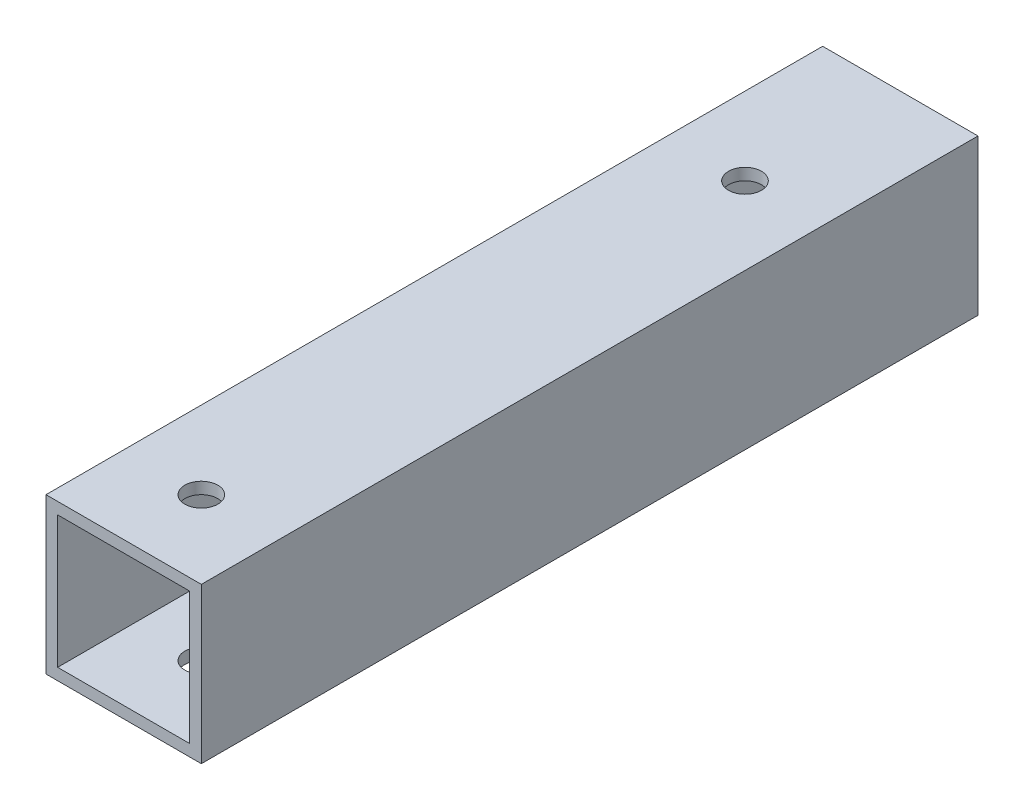
ISO-10303-21;
HEADER;
FILE_DESCRIPTION(('STEP AP214'),'2;1');
FILE_NAME('part.step','',(''),(''),'','','');
FILE_SCHEMA(('AUTOMOTIVE_DESIGN { 1 0 10303 214 1 1 1 1 }'));
ENDSEC;
DATA;
#1=APPLICATION_CONTEXT('core data for automotive mechanical design processes');
#2=APPLICATION_PROTOCOL_DEFINITION('international standard','automotive_design',2000,#1);
#3=PRODUCT_CONTEXT('',#1,'mechanical');
#4=PRODUCT('Part','Part','',(#3));
#5=PRODUCT_RELATED_PRODUCT_CATEGORY('part','',(#4));
#6=PRODUCT_DEFINITION_FORMATION('','',#4);
#7=PRODUCT_DEFINITION_CONTEXT('part definition',#1,'design');
#8=PRODUCT_DEFINITION('design','',#6,#7);
#9=PRODUCT_DEFINITION_SHAPE('','',#8);
#10=(LENGTH_UNIT() NAMED_UNIT(*) SI_UNIT(.MILLI.,.METRE.));
#11=(NAMED_UNIT(*) PLANE_ANGLE_UNIT() SI_UNIT($,.RADIAN.));
#12=(NAMED_UNIT(*) SI_UNIT($,.STERADIAN.) SOLID_ANGLE_UNIT());
#13=UNCERTAINTY_MEASURE_WITH_UNIT(LENGTH_MEASURE(1.E-05),#10,'distance_accuracy_value','');
#14=(GEOMETRIC_REPRESENTATION_CONTEXT(3) GLOBAL_UNCERTAINTY_ASSIGNED_CONTEXT((#13)) GLOBAL_UNIT_ASSIGNED_CONTEXT((#10,
#11,#12)) REPRESENTATION_CONTEXT('',''));
#15=CARTESIAN_POINT('',(0.,0.,0.));
#16=DIRECTION('',(0.,0.,1.));
#17=DIRECTION('',(1.,0.,0.));
#18=AXIS2_PLACEMENT_3D('',#15,#16,#17);
#19=CARTESIAN_POINT('',(10.,-9.99999999999999,-100.));
#20=DIRECTION('',(1.,0.,0.));
#21=DIRECTION('',(0.,0.,-1.));
#22=AXIS2_PLACEMENT_3D('',#19,#20,#21);
#23=PLANE('',#22);
#24=DIRECTION('',(0.,1.,0.));
#25=VECTOR('',#24,1.);
#26=CARTESIAN_POINT('',(10.,-9.99999999999999,0.));
#27=LINE('',#26,#25);
#28=CARTESIAN_POINT('',(10.,-9.99999999999999,0.));
#29=VERTEX_POINT('',#28);
#30=CARTESIAN_POINT('',(10.,10.,0.));
#31=VERTEX_POINT('',#30);
#32=EDGE_CURVE('E157',#29,#31,#27,.T.);
#33=ORIENTED_EDGE('',*,*,#32,.F.);
#34=DIRECTION('',(0.,0.,1.));
#35=VECTOR('',#34,1.);
#36=CARTESIAN_POINT('',(10.,-9.99999999999999,-100.));
#37=LINE('',#36,#35);
#38=CARTESIAN_POINT('',(10.,-9.99999999999999,-100.));
#39=VERTEX_POINT('',#38);
#40=EDGE_CURVE('E11',#39,#29,#37,.T.);
#41=ORIENTED_EDGE('',*,*,#40,.F.);
#42=DIRECTION('',(0.,1.,0.));
#43=VECTOR('',#42,1.);
#44=CARTESIAN_POINT('',(10.,-9.99999999999999,-100.));
#45=LINE('',#44,#43);
#46=CARTESIAN_POINT('',(10.,10.,-100.));
#47=VERTEX_POINT('',#46);
#48=EDGE_CURVE('E163',#39,#47,#45,.T.);
#49=ORIENTED_EDGE('',*,*,#48,.T.);
#50=DIRECTION('',(0.,0.,1.));
#51=VECTOR('',#50,1.);
#52=CARTESIAN_POINT('',(10.,10.,-100.));
#53=LINE('',#52,#51);
#54=EDGE_CURVE('E180',#47,#31,#53,.T.);
#55=ORIENTED_EDGE('',*,*,#54,.T.);
#56=EDGE_LOOP('',(#33,#41,#49,#55));
#57=FACE_BOUND('',#56,.T.);
#58=ADVANCED_FACE('F45',(#57),#23,.T.);
#59=CARTESIAN_POINT('',(-9.99999999999998,-9.99999999999999,-100.));
#60=DIRECTION('',(0.,-1.,0.));
#61=DIRECTION('',(0.,0.,-1.));
#62=AXIS2_PLACEMENT_3D('',#59,#60,#61);
#63=PLANE('',#62);
#64=CARTESIAN_POINT('',(0.,-9.99999999999999,-10.));
#65=DIRECTION('',(0.,1.,0.));
#66=DIRECTION('',(0.,0.,1.));
#67=AXIS2_PLACEMENT_3D('',#64,#65,#66);
#68=CIRCLE('',#67,2.125);
#69=CARTESIAN_POINT('',(0.,-9.99999999999999,-7.875));
#70=VERTEX_POINT('',#69);
#71=EDGE_CURVE('E205',#70,#70,#68,.T.);
#72=ORIENTED_EDGE('',*,*,#71,.T.);
#73=EDGE_LOOP('',(#72));
#74=FACE_BOUND('',#73,.T.);
#75=CARTESIAN_POINT('',(-2.40117429922004E-13,-9.99999999999999,-80.));
#76=DIRECTION('',(0.,1.,0.));
#77=DIRECTION('',(0.,0.,1.));
#78=AXIS2_PLACEMENT_3D('',#75,#76,#77);
#79=CIRCLE('',#78,2.125);
#80=CARTESIAN_POINT('',(-2.40117429922004E-13,-9.99999999999999,-77.875));
#81=VERTEX_POINT('',#80);
#82=EDGE_CURVE('E224',#81,#81,#79,.T.);
#83=ORIENTED_EDGE('',*,*,#82,.T.);
#84=EDGE_LOOP('',(#83));
#85=FACE_BOUND('',#84,.T.);
#86=DIRECTION('',(1.,0.,0.));
#87=VECTOR('',#86,1.);
#88=CARTESIAN_POINT('',(-9.99999999999998,-9.99999999999999,0.));
#89=LINE('',#88,#87);
#90=CARTESIAN_POINT('',(-9.99999999999998,-9.99999999999999,0.));
#91=VERTEX_POINT('',#90);
#92=EDGE_CURVE('E168',#91,#29,#89,.T.);
#93=ORIENTED_EDGE('',*,*,#92,.F.);
#94=DIRECTION('',(0.,0.,1.));
#95=VECTOR('',#94,1.);
#96=CARTESIAN_POINT('',(-9.99999999999998,-9.99999999999999,-100.));
#97=LINE('',#96,#95);
#98=CARTESIAN_POINT('',(-9.99999999999998,-9.99999999999999,-100.));
#99=VERTEX_POINT('',#98);
#100=EDGE_CURVE('E54',#99,#91,#97,.T.);
#101=ORIENTED_EDGE('',*,*,#100,.F.);
#102=DIRECTION('',(1.,0.,0.));
#103=VECTOR('',#102,1.);
#104=CARTESIAN_POINT('',(-9.99999999999998,-9.99999999999999,-100.));
#105=LINE('',#104,#103);
#106=EDGE_CURVE('E176',#99,#39,#105,.T.);
#107=ORIENTED_EDGE('',*,*,#106,.T.);
#108=ORIENTED_EDGE('',*,*,#40,.T.);
#109=EDGE_LOOP('',(#93,#101,#107,#108));
#110=FACE_BOUND('',#109,.T.);
#111=ADVANCED_FACE('F229',(#74,#85,#110),#63,.T.);
#112=CARTESIAN_POINT('',(-9.99999999999998,-9.99999999999999,-100.));
#113=DIRECTION('',(-1.,0.,0.));
#114=DIRECTION('',(0.,0.,1.));
#115=AXIS2_PLACEMENT_3D('',#112,#113,#114);
#116=PLANE('',#115);
#117=DIRECTION('',(0.,-1.,0.));
#118=VECTOR('',#117,1.);
#119=CARTESIAN_POINT('',(-9.99999999999998,-9.99999999999999,0.));
#120=LINE('',#119,#118);
#121=CARTESIAN_POINT('',(-9.99999999999998,10.,0.));
#122=VERTEX_POINT('',#121);
#123=EDGE_CURVE('E188',#122,#91,#120,.T.);
#124=ORIENTED_EDGE('',*,*,#123,.F.);
#125=DIRECTION('',(0.,0.,1.));
#126=VECTOR('',#125,1.);
#127=CARTESIAN_POINT('',(-9.99999999999998,10.,-100.));
#128=LINE('',#127,#126);
#129=CARTESIAN_POINT('',(-9.99999999999998,10.,-100.));
#130=VERTEX_POINT('',#129);
#131=EDGE_CURVE('E197',#130,#122,#128,.T.);
#132=ORIENTED_EDGE('',*,*,#131,.F.);
#133=DIRECTION('',(0.,-1.,0.));
#134=VECTOR('',#133,1.);
#135=CARTESIAN_POINT('',(-9.99999999999998,-9.99999999999999,-100.));
#136=LINE('',#135,#134);
#137=EDGE_CURVE('E172',#130,#99,#136,.T.);
#138=ORIENTED_EDGE('',*,*,#137,.T.);
#139=ORIENTED_EDGE('',*,*,#100,.T.);
#140=EDGE_LOOP('',(#124,#132,#138,#139));
#141=FACE_BOUND('',#140,.T.);
#142=ADVANCED_FACE('F257',(#141),#116,.T.);
#143=CARTESIAN_POINT('',(-9.99999999999998,10.,-100.));
#144=DIRECTION('',(0.,1.,0.));
#145=DIRECTION('',(0.,0.,1.));
#146=AXIS2_PLACEMENT_3D('',#143,#144,#145);
#147=PLANE('',#146);
#148=CARTESIAN_POINT('',(0.,10.,-10.));
#149=DIRECTION('',(0.,1.,0.));
#150=DIRECTION('',(0.,0.,1.));
#151=AXIS2_PLACEMENT_3D('',#148,#149,#150);
#152=CIRCLE('',#151,2.125);
#153=CARTESIAN_POINT('',(0.,10.,-7.875));
#154=VERTEX_POINT('',#153);
#155=EDGE_CURVE('E212',#154,#154,#152,.T.);
#156=ORIENTED_EDGE('',*,*,#155,.F.);
#157=EDGE_LOOP('',(#156));
#158=FACE_BOUND('',#157,.T.);
#159=CARTESIAN_POINT('',(-2.40117429922004E-13,10.,-80.));
#160=DIRECTION('',(0.,1.,0.));
#161=DIRECTION('',(0.,0.,1.));
#162=AXIS2_PLACEMENT_3D('',#159,#160,#161);
#163=CIRCLE('',#162,2.125);
#164=CARTESIAN_POINT('',(-2.40117429922004E-13,10.,-77.875));
#165=VERTEX_POINT('',#164);
#166=EDGE_CURVE('E218',#165,#165,#163,.T.);
#167=ORIENTED_EDGE('',*,*,#166,.F.);
#168=EDGE_LOOP('',(#167));
#169=FACE_BOUND('',#168,.T.);
#170=DIRECTION('',(-1.,0.,0.));
#171=VECTOR('',#170,1.);
#172=CARTESIAN_POINT('',(-9.99999999999998,10.,0.));
#173=LINE('',#172,#171);
#174=EDGE_CURVE('E184',#31,#122,#173,.T.);
#175=ORIENTED_EDGE('',*,*,#174,.F.);
#176=ORIENTED_EDGE('',*,*,#54,.F.);
#177=DIRECTION('',(-1.,0.,0.));
#178=VECTOR('',#177,1.);
#179=CARTESIAN_POINT('',(-9.99999999999998,10.,-100.));
#180=LINE('',#179,#178);
#181=EDGE_CURVE('E167',#47,#130,#180,.T.);
#182=ORIENTED_EDGE('',*,*,#181,.T.);
#183=ORIENTED_EDGE('',*,*,#131,.T.);
#184=EDGE_LOOP('',(#175,#176,#182,#183));
#185=FACE_BOUND('',#184,.T.);
#186=ADVANCED_FACE('F270',(#158,#169,#185),#147,.T.);
#187=CARTESIAN_POINT('',(0.,0.,-100.));
#188=DIRECTION('',(0.,0.,-1.));
#189=DIRECTION('',(-1.,0.,0.));
#190=AXIS2_PLACEMENT_3D('',#187,#188,#189);
#191=PLANE('',#190);
#192=DIRECTION('',(0.,-1.,0.));
#193=VECTOR('',#192,1.);
#194=CARTESIAN_POINT('',(-8.49999999999998,-8.49999999999999,-100.));
#195=LINE('',#194,#193);
#196=CARTESIAN_POINT('',(-8.49999999999998,8.50000000000002,-100.));
#197=VERTEX_POINT('',#196);
#198=CARTESIAN_POINT('',(-8.49999999999998,-8.49999999999999,-100.));
#199=VERTEX_POINT('',#198);
#200=EDGE_CURVE('E113',#197,#199,#195,.T.);
#201=ORIENTED_EDGE('',*,*,#200,.T.);
#202=DIRECTION('',(1.,0.,0.));
#203=VECTOR('',#202,1.);
#204=CARTESIAN_POINT('',(-8.49999999999998,-8.49999999999999,-100.));
#205=LINE('',#204,#203);
#206=CARTESIAN_POINT('',(8.50000000000002,-8.49999999999999,-100.));
#207=VERTEX_POINT('',#206);
#208=EDGE_CURVE('E123',#199,#207,#205,.T.);
#209=ORIENTED_EDGE('',*,*,#208,.T.);
#210=DIRECTION('',(0.,1.,0.));
#211=VECTOR('',#210,1.);
#212=CARTESIAN_POINT('',(8.50000000000002,-8.49999999999999,-100.));
#213=LINE('',#212,#211);
#214=CARTESIAN_POINT('',(8.50000000000002,8.50000000000002,-100.));
#215=VERTEX_POINT('',#214);
#216=EDGE_CURVE('E62',#207,#215,#213,.T.);
#217=ORIENTED_EDGE('',*,*,#216,.T.);
#218=DIRECTION('',(-1.,0.,0.));
#219=VECTOR('',#218,1.);
#220=CARTESIAN_POINT('',(-8.49999999999998,8.50000000000002,-100.));
#221=LINE('',#220,#219);
#222=EDGE_CURVE('E120',#215,#197,#221,.T.);
#223=ORIENTED_EDGE('',*,*,#222,.T.);
#224=EDGE_LOOP('',(#201,#209,#217,#223));
#225=FACE_BOUND('',#224,.T.);
#226=ORIENTED_EDGE('',*,*,#48,.F.);
#227=ORIENTED_EDGE('',*,*,#106,.F.);
#228=ORIENTED_EDGE('',*,*,#137,.F.);
#229=ORIENTED_EDGE('',*,*,#181,.F.);
#230=EDGE_LOOP('',(#226,#227,#228,#229));
#231=FACE_BOUND('',#230,.T.);
#232=ADVANCED_FACE('F128',(#225,#231),#191,.T.);
#233=CARTESIAN_POINT('',(0.,0.,0.));
#234=DIRECTION('',(0.,0.,-1.));
#235=DIRECTION('',(-1.,0.,0.));
#236=AXIS2_PLACEMENT_3D('',#233,#234,#235);
#237=PLANE('',#236);
#238=DIRECTION('',(1.,0.,0.));
#239=VECTOR('',#238,1.);
#240=CARTESIAN_POINT('',(-8.49999999999998,-8.49999999999999,0.));
#241=LINE('',#240,#239);
#242=CARTESIAN_POINT('',(-8.49999999999998,-8.49999999999999,0.));
#243=VERTEX_POINT('',#242);
#244=CARTESIAN_POINT('',(8.50000000000002,-8.49999999999999,0.));
#245=VERTEX_POINT('',#244);
#246=EDGE_CURVE('E148',#243,#245,#241,.T.);
#247=ORIENTED_EDGE('',*,*,#246,.F.);
#248=DIRECTION('',(0.,-1.,0.));
#249=VECTOR('',#248,1.);
#250=CARTESIAN_POINT('',(-8.49999999999998,-8.49999999999999,0.));
#251=LINE('',#250,#249);
#252=CARTESIAN_POINT('',(-8.49999999999998,8.50000000000002,0.));
#253=VERTEX_POINT('',#252);
#254=EDGE_CURVE('E70',#253,#243,#251,.T.);
#255=ORIENTED_EDGE('',*,*,#254,.F.);
#256=DIRECTION('',(-1.,0.,0.));
#257=VECTOR('',#256,1.);
#258=CARTESIAN_POINT('',(-8.49999999999998,8.50000000000002,0.));
#259=LINE('',#258,#257);
#260=CARTESIAN_POINT('',(8.50000000000002,8.50000000000002,0.));
#261=VERTEX_POINT('',#260);
#262=EDGE_CURVE('E132',#261,#253,#259,.T.);
#263=ORIENTED_EDGE('',*,*,#262,.F.);
#264=DIRECTION('',(0.,1.,0.));
#265=VECTOR('',#264,1.);
#266=CARTESIAN_POINT('',(8.50000000000002,-8.49999999999999,0.));
#267=LINE('',#266,#265);
#268=EDGE_CURVE('E136',#245,#261,#267,.T.);
#269=ORIENTED_EDGE('',*,*,#268,.F.);
#270=EDGE_LOOP('',(#247,#255,#263,#269));
#271=FACE_BOUND('',#270,.T.);
#272=ORIENTED_EDGE('',*,*,#32,.T.);
#273=ORIENTED_EDGE('',*,*,#174,.T.);
#274=ORIENTED_EDGE('',*,*,#123,.T.);
#275=ORIENTED_EDGE('',*,*,#92,.T.);
#276=EDGE_LOOP('',(#272,#273,#274,#275));
#277=FACE_BOUND('',#276,.T.);
#278=ADVANCED_FACE('F264',(#271,#277),#237,.F.);
#279=CARTESIAN_POINT('',(-8.49999999999998,-8.49999999999999,-100.));
#280=DIRECTION('',(-1.,0.,0.));
#281=DIRECTION('',(0.,0.,1.));
#282=AXIS2_PLACEMENT_3D('',#279,#280,#281);
#283=PLANE('',#282);
#284=ORIENTED_EDGE('',*,*,#254,.T.);
#285=DIRECTION('',(0.,0.,1.));
#286=VECTOR('',#285,1.);
#287=CARTESIAN_POINT('',(-8.49999999999998,-8.49999999999999,-100.));
#288=LINE('',#287,#286);
#289=EDGE_CURVE('E109',#199,#243,#288,.T.);
#290=ORIENTED_EDGE('',*,*,#289,.F.);
#291=ORIENTED_EDGE('',*,*,#200,.F.);
#292=DIRECTION('',(0.,0.,1.));
#293=VECTOR('',#292,1.);
#294=CARTESIAN_POINT('',(-8.49999999999998,8.50000000000002,-100.));
#295=LINE('',#294,#293);
#296=EDGE_CURVE('E154',#197,#253,#295,.T.);
#297=ORIENTED_EDGE('',*,*,#296,.T.);
#298=EDGE_LOOP('',(#284,#290,#291,#297));
#299=FACE_BOUND('',#298,.T.);
#300=ADVANCED_FACE('F111',(#299),#283,.F.);
#301=CARTESIAN_POINT('',(-8.49999999999998,8.50000000000002,-100.));
#302=DIRECTION('',(0.,1.,0.));
#303=DIRECTION('',(0.,0.,1.));
#304=AXIS2_PLACEMENT_3D('',#301,#302,#303);
#305=PLANE('',#304);
#306=CARTESIAN_POINT('',(0.,8.50000000000002,-10.));
#307=DIRECTION('',(0.,1.,0.));
#308=DIRECTION('',(0.,0.,1.));
#309=AXIS2_PLACEMENT_3D('',#306,#307,#308);
#310=CIRCLE('',#309,2.125);
#311=CARTESIAN_POINT('',(0.,8.50000000000002,-7.875));
#312=VERTEX_POINT('',#311);
#313=EDGE_CURVE('E139',#312,#312,#310,.T.);
#314=ORIENTED_EDGE('',*,*,#313,.T.);
#315=EDGE_LOOP('',(#314));
#316=FACE_BOUND('',#315,.T.);
#317=CARTESIAN_POINT('',(-2.40117429922004E-13,8.50000000000002,-80.));
#318=DIRECTION('',(0.,1.,0.));
#319=DIRECTION('',(0.,0.,1.));
#320=AXIS2_PLACEMENT_3D('',#317,#318,#319);
#321=CIRCLE('',#320,2.125);
#322=CARTESIAN_POINT('',(-2.40117429922004E-13,8.50000000000002,-77.875));
#323=VERTEX_POINT('',#322);
#324=EDGE_CURVE('E204',#323,#323,#321,.T.);
#325=ORIENTED_EDGE('',*,*,#324,.T.);
#326=EDGE_LOOP('',(#325));
#327=FACE_BOUND('',#326,.T.);
#328=ORIENTED_EDGE('',*,*,#262,.T.);
#329=ORIENTED_EDGE('',*,*,#296,.F.);
#330=ORIENTED_EDGE('',*,*,#222,.F.);
#331=DIRECTION('',(0.,0.,1.));
#332=VECTOR('',#331,1.);
#333=CARTESIAN_POINT('',(8.50000000000002,8.50000000000002,-100.));
#334=LINE('',#333,#332);
#335=EDGE_CURVE('E158',#215,#261,#334,.T.);
#336=ORIENTED_EDGE('',*,*,#335,.T.);
#337=EDGE_LOOP('',(#328,#329,#330,#336));
#338=FACE_BOUND('',#337,.T.);
#339=ADVANCED_FACE('F284',(#316,#327,#338),#305,.F.);
#340=CARTESIAN_POINT('',(8.50000000000002,-8.49999999999999,-100.));
#341=DIRECTION('',(1.,0.,0.));
#342=DIRECTION('',(0.,0.,-1.));
#343=AXIS2_PLACEMENT_3D('',#340,#341,#342);
#344=PLANE('',#343);
#345=ORIENTED_EDGE('',*,*,#268,.T.);
#346=ORIENTED_EDGE('',*,*,#335,.F.);
#347=ORIENTED_EDGE('',*,*,#216,.F.);
#348=DIRECTION('',(0.,0.,1.));
#349=VECTOR('',#348,1.);
#350=CARTESIAN_POINT('',(8.50000000000002,-8.49999999999999,-100.));
#351=LINE('',#350,#349);
#352=EDGE_CURVE('E119',#207,#245,#351,.T.);
#353=ORIENTED_EDGE('',*,*,#352,.T.);
#354=EDGE_LOOP('',(#345,#346,#347,#353));
#355=FACE_BOUND('',#354,.T.);
#356=ADVANCED_FACE('F245',(#355),#344,.F.);
#357=CARTESIAN_POINT('',(-8.49999999999998,-8.49999999999999,-100.));
#358=DIRECTION('',(0.,-1.,0.));
#359=DIRECTION('',(0.,0.,-1.));
#360=AXIS2_PLACEMENT_3D('',#357,#358,#359);
#361=PLANE('',#360);
#362=CARTESIAN_POINT('',(0.,-8.49999999999999,-10.));
#363=DIRECTION('',(0.,-1.,0.));
#364=DIRECTION('',(0.,0.,-1.));
#365=AXIS2_PLACEMENT_3D('',#362,#363,#364);
#366=CIRCLE('',#365,2.125);
#367=CARTESIAN_POINT('',(0.,-8.49999999999999,-12.125));
#368=VERTEX_POINT('',#367);
#369=EDGE_CURVE('E48',#368,#368,#366,.T.);
#370=ORIENTED_EDGE('',*,*,#369,.T.);
#371=EDGE_LOOP('',(#370));
#372=FACE_BOUND('',#371,.T.);
#373=CARTESIAN_POINT('',(-2.40117429922004E-13,-8.49999999999999,-80.));
#374=DIRECTION('',(0.,-1.,0.));
#375=DIRECTION('',(0.,0.,-1.));
#376=AXIS2_PLACEMENT_3D('',#373,#374,#375);
#377=CIRCLE('',#376,2.125);
#378=CARTESIAN_POINT('',(-2.40117429922004E-13,-8.49999999999999,-82.125));
#379=VERTEX_POINT('',#378);
#380=EDGE_CURVE('E201',#379,#379,#377,.T.);
#381=ORIENTED_EDGE('',*,*,#380,.T.);
#382=EDGE_LOOP('',(#381));
#383=FACE_BOUND('',#382,.T.);
#384=ORIENTED_EDGE('',*,*,#246,.T.);
#385=ORIENTED_EDGE('',*,*,#352,.F.);
#386=ORIENTED_EDGE('',*,*,#208,.F.);
#387=ORIENTED_EDGE('',*,*,#289,.T.);
#388=EDGE_LOOP('',(#384,#385,#386,#387));
#389=FACE_BOUND('',#388,.T.);
#390=ADVANCED_FACE('F124',(#372,#383,#389),#361,.F.);
#391=CARTESIAN_POINT('',(-2.40117429922004E-13,-9.99999999999999,-80.));
#392=DIRECTION('',(0.,1.,0.));
#393=DIRECTION('',(0.,0.,1.));
#394=AXIS2_PLACEMENT_3D('',#391,#392,#393);
#395=CYLINDRICAL_SURFACE('',#394,2.125);
#396=ORIENTED_EDGE('',*,*,#82,.F.);
#397=EDGE_LOOP('',(#396));
#398=FACE_BOUND('',#397,.T.);
#399=ORIENTED_EDGE('',*,*,#380,.F.);
#400=EDGE_LOOP('',(#399));
#401=FACE_BOUND('',#400,.T.);
#402=ADVANCED_FACE('F232',(#398,#401),#395,.F.);
#403=CARTESIAN_POINT('',(0.,-9.99999999999999,-10.));
#404=DIRECTION('',(0.,1.,0.));
#405=DIRECTION('',(0.,0.,1.));
#406=AXIS2_PLACEMENT_3D('',#403,#404,#405);
#407=CYLINDRICAL_SURFACE('',#406,2.125);
#408=ORIENTED_EDGE('',*,*,#71,.F.);
#409=EDGE_LOOP('',(#408));
#410=FACE_BOUND('',#409,.T.);
#411=ORIENTED_EDGE('',*,*,#369,.F.);
#412=EDGE_LOOP('',(#411));
#413=FACE_BOUND('',#412,.T.);
#414=ADVANCED_FACE('F235',(#410,#413),#407,.F.);
#415=ORIENTED_EDGE('',*,*,#166,.T.);
#416=EDGE_LOOP('',(#415));
#417=FACE_BOUND('',#416,.T.);
#418=ORIENTED_EDGE('',*,*,#324,.F.);
#419=EDGE_LOOP('',(#418));
#420=FACE_BOUND('',#419,.T.);
#421=ADVANCED_FACE('F237',(#417,#420),#395,.F.);
#422=ORIENTED_EDGE('',*,*,#155,.T.);
#423=EDGE_LOOP('',(#422));
#424=FACE_BOUND('',#423,.T.);
#425=ORIENTED_EDGE('',*,*,#313,.F.);
#426=EDGE_LOOP('',(#425));
#427=FACE_BOUND('',#426,.T.);
#428=ADVANCED_FACE('F244',(#424,#427),#407,.F.);
#429=CLOSED_SHELL('',(#58,#111,#142,#186,#232,#278,#300,#339,#356,#390,#402,#414,#421,#428));
#430=MANIFOLD_SOLID_BREP('B2',#429);
#431=ADVANCED_BREP_SHAPE_REPRESENTATION('',(#18,#430),#14);
#432=SHAPE_DEFINITION_REPRESENTATION(#9,#431);
ENDSEC;
END-ISO-10303-21;
